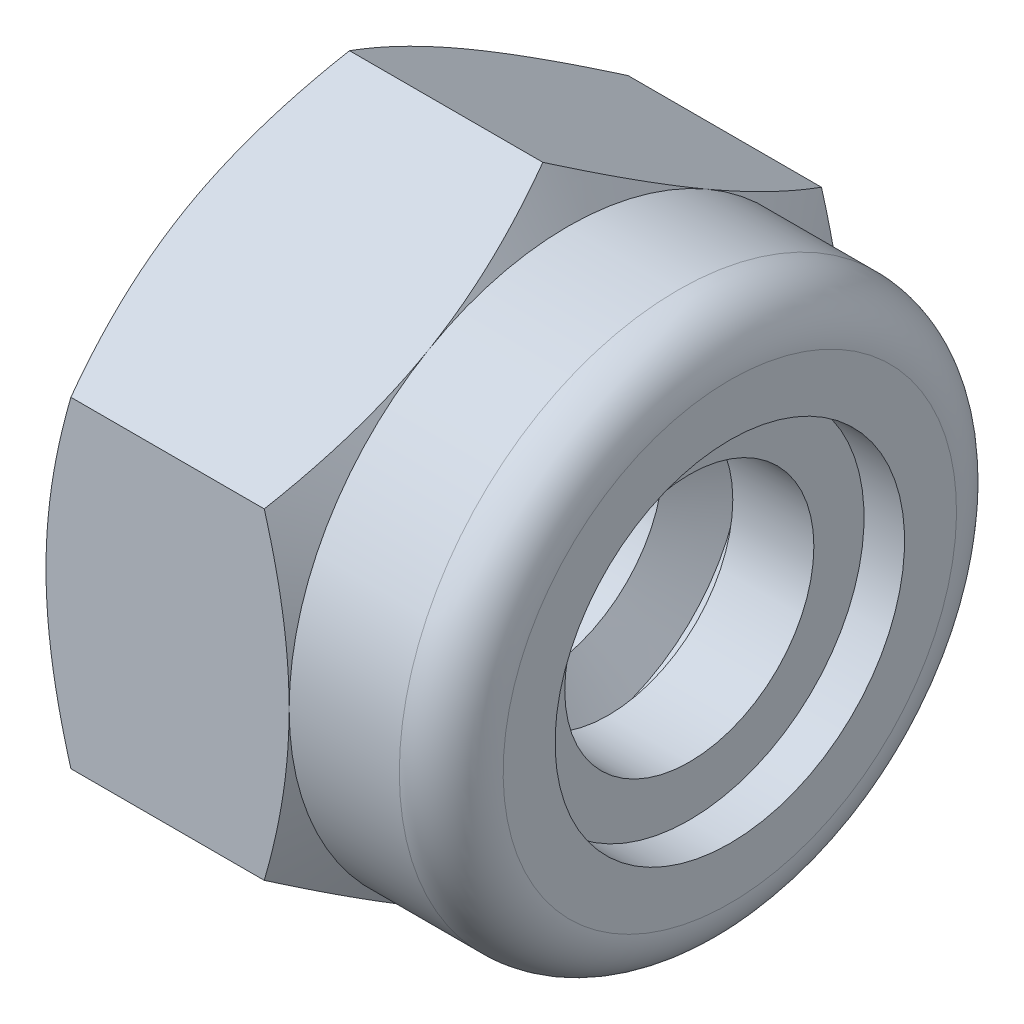
ISO-10303-21;
HEADER;
FILE_DESCRIPTION(('STEP AP214'),'2;1');
FILE_NAME('part.step','',(''),(''),'','','');
FILE_SCHEMA(('AUTOMOTIVE_DESIGN { 1 0 10303 214 1 1 1 1 }'));
ENDSEC;
DATA;
#1=APPLICATION_CONTEXT('core data for automotive mechanical design processes');
#2=APPLICATION_PROTOCOL_DEFINITION('international standard','automotive_design',2000,#1);
#3=PRODUCT_CONTEXT('',#1,'mechanical');
#4=PRODUCT('Part','Part','',(#3));
#5=PRODUCT_RELATED_PRODUCT_CATEGORY('part','',(#4));
#6=PRODUCT_DEFINITION_FORMATION('','',#4);
#7=PRODUCT_DEFINITION_CONTEXT('part definition',#1,'design');
#8=PRODUCT_DEFINITION('design','',#6,#7);
#9=PRODUCT_DEFINITION_SHAPE('','',#8);
#10=(LENGTH_UNIT() NAMED_UNIT(*) SI_UNIT(.MILLI.,.METRE.));
#11=(NAMED_UNIT(*) PLANE_ANGLE_UNIT() SI_UNIT($,.RADIAN.));
#12=(NAMED_UNIT(*) SI_UNIT($,.STERADIAN.) SOLID_ANGLE_UNIT());
#13=UNCERTAINTY_MEASURE_WITH_UNIT(LENGTH_MEASURE(1.E-05),#10,'distance_accuracy_value','');
#14=(GEOMETRIC_REPRESENTATION_CONTEXT(3) GLOBAL_UNCERTAINTY_ASSIGNED_CONTEXT((#13)) GLOBAL_UNIT_ASSIGNED_CONTEXT((#10,
#11,#12)) REPRESENTATION_CONTEXT('',''));
#15=CARTESIAN_POINT('',(0.,0.,0.));
#16=DIRECTION('',(0.,0.,1.));
#17=DIRECTION('',(1.,0.,0.));
#18=AXIS2_PLACEMENT_3D('',#15,#16,#17);
#19=CARTESIAN_POINT('',(5.,-1.58771324027147,2.75));
#20=DIRECTION('',(0.,0.866025403784439,-0.5));
#21=DIRECTION('',(0.,0.5,0.866025403784439));
#22=AXIS2_PLACEMENT_3D('',#19,#20,#21);
#23=PLANE('',#22);
#24=CARTESIAN_POINT('',(2.1543799069394,-3.17542648054303,-1.6002824065886E-13));
#25=CARTESIAN_POINT('',(2.4,-2.75000000000232,0.736860279181575));
#26=CARTESIAN_POINT('',(2.4,-2.3815698604072,1.375));
#27=B_SPLINE_CURVE_WITH_KNOTS('',2,(#24,#25,#26),.UNSPECIFIED.,.F.,.F.,(3,3),(0.,1.),.UNSPECIFIED.);
#28=CARTESIAN_POINT('',(2.15437990693814,-3.17542648054294,0.));
#29=VERTEX_POINT('',#28);
#30=CARTESIAN_POINT('',(2.4,-2.38156986040721,1.375));
#31=VERTEX_POINT('',#30);
#32=EDGE_CURVE('E667',#29,#31,#27,.T.);
#33=ORIENTED_EDGE('',*,*,#32,.T.);
#34=CARTESIAN_POINT('',(2.4,-2.3815698604072,1.375));
#35=CARTESIAN_POINT('',(2.4,-2.18505385013521,1.71537571429182));
#36=CARTESIAN_POINT('',(2.33369548248391,-1.98006511908093,2.07042661145691));
#37=CARTESIAN_POINT('',(2.27355300018248,-1.79412709266464,2.392480720269));
#38=CARTESIAN_POINT('',(2.15437990693878,-1.58771324027142,2.75000000000009));
#39=B_SPLINE_CURVE_WITH_KNOTS('',2,(#34,#35,#36,#37,#38),.UNSPECIFIED.,.F.,.F.,(3,2,3),(0.,0.5,
1.),.UNSPECIFIED.);
#40=CARTESIAN_POINT('',(2.15437990693813,-1.58771324027147,2.75));
#41=VERTEX_POINT('',#40);
#42=EDGE_CURVE('E576',#31,#41,#39,.T.);
#43=ORIENTED_EDGE('',*,*,#42,.T.);
#44=DIRECTION('',(-1.,0.,0.));
#45=VECTOR('',#44,1.);
#46=CARTESIAN_POINT('',(5.,-1.58771324027147,2.75));
#47=LINE('',#46,#45);
#48=CARTESIAN_POINT('',(0.245620093061862,-1.58771324027147,2.75));
#49=VERTEX_POINT('',#48);
#50=EDGE_CURVE('E419',#41,#49,#47,.T.);
#51=ORIENTED_EDGE('',*,*,#50,.T.);
#52=CARTESIAN_POINT('',(0.245620093060599,-1.58771324027138,2.75000000000016));
#53=CARTESIAN_POINT('',(0.,-2.0131397208121,2.01313972081842));
#54=CARTESIAN_POINT('',(0.,-2.3815698604072,1.375));
#55=B_SPLINE_CURVE_WITH_KNOTS('',2,(#52,#53,#54),.UNSPECIFIED.,.F.,.F.,(3,3),(0.,1.),.UNSPECIFIED.);
#56=CARTESIAN_POINT('',(0.,-2.38156986040721,1.375));
#57=VERTEX_POINT('',#56);
#58=EDGE_CURVE('E127',#49,#57,#55,.T.);
#59=ORIENTED_EDGE('',*,*,#58,.T.);
#60=CARTESIAN_POINT('',(0.,-2.3815698604072,1.375));
#61=CARTESIAN_POINT('',(0.,-2.57808587067984,1.03462428570707));
#62=CARTESIAN_POINT('',(0.0663045175160774,-2.78307460173348,0.679573388543088));
#63=CARTESIAN_POINT('',(0.126446999817929,-2.96901262815049,0.357519279729742));
#64=CARTESIAN_POINT('',(0.245620093061218,-3.17542648054299,0.));
#65=B_SPLINE_CURVE_WITH_KNOTS('',2,(#60,#61,#62,#63,#64),.UNSPECIFIED.,.F.,.F.,(3,2,3),(0.,0.5,
1.),.UNSPECIFIED.);
#66=CARTESIAN_POINT('',(0.245620093061861,-3.17542648054294,0.));
#67=VERTEX_POINT('',#66);
#68=EDGE_CURVE('E436',#57,#67,#65,.T.);
#69=ORIENTED_EDGE('',*,*,#68,.T.);
#70=DIRECTION('',(-1.,0.,0.));
#71=VECTOR('',#70,1.);
#72=CARTESIAN_POINT('',(5.,-3.17542648054294,0.));
#73=LINE('',#72,#71);
#74=EDGE_CURVE('E452',#29,#67,#73,.T.);
#75=ORIENTED_EDGE('',*,*,#74,.F.);
#76=EDGE_LOOP('',(#33,#43,#51,#59,#69,#75));
#77=FACE_BOUND('',#76,.T.);
#78=ADVANCED_FACE('F16',(#77),#23,.F.);
#79=CARTESIAN_POINT('',(5.,3.17542648054294,0.));
#80=DIRECTION('',(0.,-0.866025403784439,-0.5));
#81=DIRECTION('',(0.,0.5,-0.866025403784439));
#82=AXIS2_PLACEMENT_3D('',#79,#80,#81);
#83=PLANE('',#82);
#84=CARTESIAN_POINT('',(2.1543799069394,1.58771324027138,2.75000000000016));
#85=CARTESIAN_POINT('',(2.4,2.0131397208121,2.01313972081842));
#86=CARTESIAN_POINT('',(2.4,2.3815698604072,1.375));
#87=B_SPLINE_CURVE_WITH_KNOTS('',2,(#84,#85,#86),.UNSPECIFIED.,.F.,.F.,(3,3),(0.,1.),.UNSPECIFIED.);
#88=CARTESIAN_POINT('',(2.15437990693813,1.58771324027147,2.75));
#89=VERTEX_POINT('',#88);
#90=CARTESIAN_POINT('',(2.4,2.38156986040721,1.375));
#91=VERTEX_POINT('',#90);
#92=EDGE_CURVE('E589',#89,#91,#87,.T.);
#93=ORIENTED_EDGE('',*,*,#92,.T.);
#94=CARTESIAN_POINT('',(2.4,2.3815698604072,1.375));
#95=CARTESIAN_POINT('',(2.4,2.5780858706798,1.03462428570715));
#96=CARTESIAN_POINT('',(2.33369548248391,2.78307460173348,0.67957338854309));
#97=CARTESIAN_POINT('',(2.27355300018209,2.96901262815045,0.357519279729818));
#98=CARTESIAN_POINT('',(2.15437990693878,3.17542648054299,0.));
#99=B_SPLINE_CURVE_WITH_KNOTS('',2,(#94,#95,#96,#97,#98),.UNSPECIFIED.,.F.,.F.,(3,2,3),(0.,0.5,
1.),.UNSPECIFIED.);
#100=CARTESIAN_POINT('',(2.15437990693814,3.17542648054294,0.));
#101=VERTEX_POINT('',#100);
#102=EDGE_CURVE('E11',#91,#101,#99,.T.);
#103=ORIENTED_EDGE('',*,*,#102,.T.);
#104=DIRECTION('',(-1.,0.,0.));
#105=VECTOR('',#104,1.);
#106=CARTESIAN_POINT('',(5.,3.17542648054294,0.));
#107=LINE('',#106,#105);
#108=CARTESIAN_POINT('',(0.245620093061862,3.17542648054294,0.));
#109=VERTEX_POINT('',#108);
#110=EDGE_CURVE('E165',#101,#109,#107,.T.);
#111=ORIENTED_EDGE('',*,*,#110,.T.);
#112=CARTESIAN_POINT('',(0.245620093060599,3.17542648054303,-1.5692617821637E-13));
#113=CARTESIAN_POINT('',(0.,2.75000000000231,0.736860279181582));
#114=CARTESIAN_POINT('',(0.,2.3815698604072,1.375));
#115=B_SPLINE_CURVE_WITH_KNOTS('',2,(#112,#113,#114),.UNSPECIFIED.,.F.,.F.,(3,3),(0.,1.),.UNSPECIFIED.);
#116=CARTESIAN_POINT('',(0.,2.38156986040721,1.375));
#117=VERTEX_POINT('',#116);
#118=EDGE_CURVE('E158',#109,#117,#115,.T.);
#119=ORIENTED_EDGE('',*,*,#118,.T.);
#120=CARTESIAN_POINT('',(0.,2.3815698604072,1.375));
#121=CARTESIAN_POINT('',(0.,2.18505385013356,1.71537571429469));
#122=CARTESIAN_POINT('',(0.0663045175160774,1.98006511908093,2.07042661145691));
#123=CARTESIAN_POINT('',(0.126446999818618,1.79412709266273,2.39248072027231));
#124=CARTESIAN_POINT('',(0.245620093061218,1.58771324027141,2.7500000000001));
#125=B_SPLINE_CURVE_WITH_KNOTS('',2,(#120,#121,#122,#123,#124),.UNSPECIFIED.,.F.,.F.,(3,2,3),
(0.,0.5,1.),.UNSPECIFIED.);
#126=CARTESIAN_POINT('',(0.245620093061863,1.58771324027147,2.75));
#127=VERTEX_POINT('',#126);
#128=EDGE_CURVE('E149',#117,#127,#125,.T.);
#129=ORIENTED_EDGE('',*,*,#128,.T.);
#130=DIRECTION('',(-1.,0.,0.));
#131=VECTOR('',#130,1.);
#132=CARTESIAN_POINT('',(5.,1.58771324027147,2.75));
#133=LINE('',#132,#131);
#134=EDGE_CURVE('E155',#89,#127,#133,.T.);
#135=ORIENTED_EDGE('',*,*,#134,.F.);
#136=EDGE_LOOP('',(#93,#103,#111,#119,#129,#135));
#137=FACE_BOUND('',#136,.T.);
#138=ADVANCED_FACE('F153',(#137),#83,.F.);
#139=CARTESIAN_POINT('',(2.4,0.,0.));
#140=DIRECTION('',(-1.,0.,0.));
#141=DIRECTION('',(0.,-1.,0.));
#142=AXIS2_PLACEMENT_3D('',#139,#140,#141);
#143=CONICAL_SURFACE('',#142,2.75,1.0471975511966);
#144=CARTESIAN_POINT('',(2.4,2.3815698604072,-1.375));
#145=CARTESIAN_POINT('',(2.4,2.18505385013459,-1.71537571429289));
#146=CARTESIAN_POINT('',(2.33369548248391,1.98006511908093,-2.07042661145691));
#147=CARTESIAN_POINT('',(2.27355300018207,1.79412709266394,-2.39248072027022));
#148=CARTESIAN_POINT('',(2.15437990693878,1.58771324027142,-2.75000000000009));
#149=B_SPLINE_CURVE_WITH_KNOTS('',2,(#144,#145,#146,#147,#148),.UNSPECIFIED.,.F.,.F.,(3,2,3),
(0.,0.5,1.),.UNSPECIFIED.);
#150=CARTESIAN_POINT('',(2.4,2.38156986040721,-1.375));
#151=VERTEX_POINT('',#150);
#152=CARTESIAN_POINT('',(2.15437990693813,1.58771324027147,-2.75));
#153=VERTEX_POINT('',#152);
#154=EDGE_CURVE('E194',#151,#153,#149,.T.);
#155=ORIENTED_EDGE('',*,*,#154,.F.);
#156=CARTESIAN_POINT('',(2.4,0.,0.));
#157=DIRECTION('',(1.,0.,0.));
#158=DIRECTION('',(0.,1.,0.));
#159=AXIS2_PLACEMENT_3D('',#156,#157,#158);
#160=CIRCLE('',#159,2.75);
#161=CARTESIAN_POINT('',(2.40000000000156,1.24444177268012E-13,-2.75));
#162=VERTEX_POINT('',#161);
#163=EDGE_CURVE('E646',#162,#151,#160,.T.);
#164=ORIENTED_EDGE('',*,*,#163,.F.);
#165=CARTESIAN_POINT('',(2.15437990693813,1.58771324027147,-2.75));
#166=CARTESIAN_POINT('',(2.27292535233722,1.1770597713973,-2.75));
#167=CARTESIAN_POINT('',(2.3332244982029,0.80591500351772,-2.75));
#168=CARTESIAN_POINT('',(2.4,0.39490788627372,-2.75));
#169=CARTESIAN_POINT('',(2.4,2.59991680962024E-13,-2.75));
#170=B_SPLINE_CURVE_WITH_KNOTS('',2,(#165,#166,#167,#168,#169),.UNSPECIFIED.,.F.,.F.,(3,2,3),
(0.,0.5,1.),.UNSPECIFIED.);
#171=EDGE_CURVE('E660',#153,#162,#170,.T.);
#172=ORIENTED_EDGE('',*,*,#171,.F.);
#173=EDGE_LOOP('',(#155,#164,#172));
#174=FACE_BOUND('',#173,.T.);
#175=ADVANCED_FACE('F472',(#174),#143,.T.);
#176=CARTESIAN_POINT('',(2.4,0.,0.));
#177=DIRECTION('',(-1.,0.,0.));
#178=DIRECTION('',(0.,-1.,0.));
#179=AXIS2_PLACEMENT_3D('',#176,#177,#178);
#180=CONICAL_SURFACE('',#179,2.75,1.0471975511966);
#181=CARTESIAN_POINT('',(2.1543799069394,3.17542648054303,1.6002824065886E-13));
#182=CARTESIAN_POINT('',(2.4,2.75000000000232,-0.736860279181575));
#183=CARTESIAN_POINT('',(2.4,2.3815698604072,-1.375));
#184=B_SPLINE_CURVE_WITH_KNOTS('',2,(#181,#182,#183),.UNSPECIFIED.,.F.,.F.,(3,3),(0.,1.),.UNSPECIFIED.);
#185=EDGE_CURVE('E657',#101,#151,#184,.T.);
#186=ORIENTED_EDGE('',*,*,#185,.F.);
#187=ORIENTED_EDGE('',*,*,#102,.F.);
#188=CARTESIAN_POINT('',(2.4,0.,0.));
#189=DIRECTION('',(1.,0.,0.));
#190=DIRECTION('',(0.,1.,0.));
#191=AXIS2_PLACEMENT_3D('',#188,#189,#190);
#192=CIRCLE('',#191,2.75);
#193=EDGE_CURVE('E638',#151,#91,#192,.T.);
#194=ORIENTED_EDGE('',*,*,#193,.F.);
#195=EDGE_LOOP('',(#186,#187,#194));
#196=FACE_BOUND('',#195,.T.);
#197=ADVANCED_FACE('F356',(#196),#180,.T.);
#198=CARTESIAN_POINT('',(3.4875,0.,0.));
#199=DIRECTION('',(1.,0.,0.));
#200=DIRECTION('',(0.,1.,0.));
#201=AXIS2_PLACEMENT_3D('',#198,#199,#200);
#202=TOROIDAL_SURFACE('',#201,2.2375,0.5125);
#203=CARTESIAN_POINT('',(4.,0.,0.));
#204=DIRECTION('',(1.,0.,0.));
#205=DIRECTION('',(0.,1.,0.));
#206=AXIS2_PLACEMENT_3D('',#203,#204,#205);
#207=CIRCLE('',#206,2.2375);
#208=CARTESIAN_POINT('',(4.,2.2375,0.));
#209=VERTEX_POINT('',#208);
#210=EDGE_CURVE('E28',#209,#209,#207,.T.);
#211=ORIENTED_EDGE('',*,*,#210,.F.);
#212=EDGE_LOOP('',(#211));
#213=FACE_BOUND('',#212,.T.);
#214=CARTESIAN_POINT('',(3.4875,0.,0.));
#215=DIRECTION('',(1.,0.,0.));
#216=DIRECTION('',(0.,1.,0.));
#217=AXIS2_PLACEMENT_3D('',#214,#215,#216);
#218=CIRCLE('',#217,2.75);
#219=CARTESIAN_POINT('',(3.4875,2.75,0.));
#220=VERTEX_POINT('',#219);
#221=EDGE_CURVE('E645',#220,#220,#218,.T.);
#222=ORIENTED_EDGE('',*,*,#221,.T.);
#223=EDGE_LOOP('',(#222));
#224=FACE_BOUND('',#223,.T.);
#225=ADVANCED_FACE('F257',(#213,#224),#202,.T.);
#226=CARTESIAN_POINT('',(4.,1.725,0.));
#227=DIRECTION('',(1.,0.,0.));
#228=DIRECTION('',(0.,1.,0.));
#229=AXIS2_PLACEMENT_3D('',#226,#227,#228);
#230=PLANE('',#229);
#231=CARTESIAN_POINT('',(4.,0.,0.));
#232=DIRECTION('',(1.,0.,0.));
#233=DIRECTION('',(0.,1.,0.));
#234=AXIS2_PLACEMENT_3D('',#231,#232,#233);
#235=CIRCLE('',#234,1.725);
#236=CARTESIAN_POINT('',(4.,1.725,0.));
#237=VERTEX_POINT('',#236);
#238=EDGE_CURVE('E719',#237,#237,#235,.T.);
#239=ORIENTED_EDGE('',*,*,#238,.F.);
#240=EDGE_LOOP('',(#239));
#241=FACE_BOUND('',#240,.T.);
#242=ORIENTED_EDGE('',*,*,#210,.T.);
#243=EDGE_LOOP('',(#242));
#244=FACE_BOUND('',#243,.T.);
#245=ADVANCED_FACE('F554',(#241,#244),#230,.T.);
#246=CARTESIAN_POINT('',(4.,0.,0.));
#247=DIRECTION('',(1.,0.,0.));
#248=DIRECTION('',(0.,1.,0.));
#249=AXIS2_PLACEMENT_3D('',#246,#247,#248);
#250=CYLINDRICAL_SURFACE('',#249,1.725);
#251=CARTESIAN_POINT('',(3.6,0.,0.));
#252=DIRECTION('',(1.,0.,0.));
#253=DIRECTION('',(0.,1.,0.));
#254=AXIS2_PLACEMENT_3D('',#251,#252,#253);
#255=CIRCLE('',#254,1.725);
#256=CARTESIAN_POINT('',(3.6,1.725,0.));
#257=VERTEX_POINT('',#256);
#258=EDGE_CURVE('E721',#257,#257,#255,.T.);
#259=ORIENTED_EDGE('',*,*,#258,.F.);
#260=EDGE_LOOP('',(#259));
#261=FACE_BOUND('',#260,.T.);
#262=ORIENTED_EDGE('',*,*,#238,.T.);
#263=EDGE_LOOP('',(#262));
#264=FACE_BOUND('',#263,.T.);
#265=ADVANCED_FACE('F526',(#261,#264),#250,.F.);
#266=CARTESIAN_POINT('',(3.6,1.2295,0.));
#267=DIRECTION('',(1.,0.,0.));
#268=DIRECTION('',(0.,1.,0.));
#269=AXIS2_PLACEMENT_3D('',#266,#267,#268);
#270=PLANE('',#269);
#271=CARTESIAN_POINT('',(3.6,0.,0.));
#272=DIRECTION('',(1.,0.,0.));
#273=DIRECTION('',(0.,1.,0.));
#274=AXIS2_PLACEMENT_3D('',#271,#272,#273);
#275=CIRCLE('',#274,1.2295);
#276=CARTESIAN_POINT('',(3.6,1.2295,0.));
#277=VERTEX_POINT('',#276);
#278=EDGE_CURVE('E722',#277,#277,#275,.T.);
#279=ORIENTED_EDGE('',*,*,#278,.F.);
#280=EDGE_LOOP('',(#279));
#281=FACE_BOUND('',#280,.T.);
#282=ORIENTED_EDGE('',*,*,#258,.T.);
#283=EDGE_LOOP('',(#282));
#284=FACE_BOUND('',#283,.T.);
#285=ADVANCED_FACE('F735',(#281,#284),#270,.T.);
#286=CARTESIAN_POINT('',(4.,0.,0.));
#287=DIRECTION('',(1.,0.,0.));
#288=DIRECTION('',(0.,1.,0.));
#289=AXIS2_PLACEMENT_3D('',#286,#287,#288);
#290=CYLINDRICAL_SURFACE('',#289,1.2295);
#291=CARTESIAN_POINT('',(2.8,0.,0.));
#292=DIRECTION('',(1.,0.,0.));
#293=DIRECTION('',(0.,1.,0.));
#294=AXIS2_PLACEMENT_3D('',#291,#292,#293);
#295=CIRCLE('',#294,1.2295);
#296=CARTESIAN_POINT('',(2.8,1.2295,0.));
#297=VERTEX_POINT('',#296);
#298=EDGE_CURVE('E93',#297,#297,#295,.T.);
#299=ORIENTED_EDGE('',*,*,#298,.F.);
#300=EDGE_LOOP('',(#299));
#301=FACE_BOUND('',#300,.T.);
#302=ORIENTED_EDGE('',*,*,#278,.T.);
#303=EDGE_LOOP('',(#302));
#304=FACE_BOUND('',#303,.T.);
#305=ADVANCED_FACE('F601',(#301,#304),#290,.F.);
#306=CARTESIAN_POINT('',(2.8,1.725,0.));
#307=DIRECTION('',(-1.,0.,0.));
#308=DIRECTION('',(0.,-1.,0.));
#309=AXIS2_PLACEMENT_3D('',#306,#307,#308);
#310=PLANE('',#309);
#311=CARTESIAN_POINT('',(2.8,0.,0.));
#312=DIRECTION('',(1.,0.,0.));
#313=DIRECTION('',(0.,1.,0.));
#314=AXIS2_PLACEMENT_3D('',#311,#312,#313);
#315=CIRCLE('',#314,1.725);
#316=CARTESIAN_POINT('',(2.8,1.725,0.));
#317=VERTEX_POINT('',#316);
#318=EDGE_CURVE('E99',#317,#317,#315,.T.);
#319=ORIENTED_EDGE('',*,*,#318,.F.);
#320=EDGE_LOOP('',(#319));
#321=FACE_BOUND('',#320,.T.);
#322=ORIENTED_EDGE('',*,*,#298,.T.);
#323=EDGE_LOOP('',(#322));
#324=FACE_BOUND('',#323,.T.);
#325=ADVANCED_FACE('F18',(#321,#324),#310,.T.);
#326=CARTESIAN_POINT('',(4.,0.,0.));
#327=DIRECTION('',(1.,0.,0.));
#328=DIRECTION('',(0.,1.,0.));
#329=AXIS2_PLACEMENT_3D('',#326,#327,#328);
#330=CYLINDRICAL_SURFACE('',#329,1.725);
#331=CARTESIAN_POINT('',(2.4,0.,0.));
#332=DIRECTION('',(1.,0.,0.));
#333=DIRECTION('',(0.,1.,0.));
#334=AXIS2_PLACEMENT_3D('',#331,#332,#333);
#335=CIRCLE('',#334,1.725);
#336=CARTESIAN_POINT('',(2.4,1.725,0.));
#337=VERTEX_POINT('',#336);
#338=EDGE_CURVE('E725',#337,#337,#335,.T.);
#339=ORIENTED_EDGE('',*,*,#338,.F.);
#340=EDGE_LOOP('',(#339));
#341=FACE_BOUND('',#340,.T.);
#342=ORIENTED_EDGE('',*,*,#318,.T.);
#343=EDGE_LOOP('',(#342));
#344=FACE_BOUND('',#343,.T.);
#345=ADVANCED_FACE('F973',(#341,#344),#330,.F.);
#346=CARTESIAN_POINT('',(2.11392294161654,0.,0.));
#347=DIRECTION('',(1.,0.,0.));
#348=DIRECTION('',(0.,1.,0.));
#349=AXIS2_PLACEMENT_3D('',#346,#347,#348);
#350=CONICAL_SURFACE('',#349,1.2295,1.0471975511966);
#351=CARTESIAN_POINT('',(2.11392294161654,0.,0.));
#352=DIRECTION('',(1.,0.,0.));
#353=DIRECTION('',(0.,1.,0.));
#354=AXIS2_PLACEMENT_3D('',#351,#352,#353);
#355=CIRCLE('',#354,1.2295);
#356=CARTESIAN_POINT('',(2.11392294161654,1.2295,0.));
#357=VERTEX_POINT('',#356);
#358=EDGE_CURVE('E717',#357,#357,#355,.T.);
#359=ORIENTED_EDGE('',*,*,#358,.F.);
#360=EDGE_LOOP('',(#359));
#361=FACE_BOUND('',#360,.T.);
#362=ORIENTED_EDGE('',*,*,#338,.T.);
#363=EDGE_LOOP('',(#362));
#364=FACE_BOUND('',#363,.T.);
#365=ADVANCED_FACE('F964',(#361,#364),#350,.F.);
#366=CARTESIAN_POINT('',(4.,0.,0.));
#367=DIRECTION('',(1.,0.,0.));
#368=DIRECTION('',(0.,1.,0.));
#369=AXIS2_PLACEMENT_3D('',#366,#367,#368);
#370=CYLINDRICAL_SURFACE('',#369,1.2295);
#371=CARTESIAN_POINT('',(0.286077058383459,0.,0.));
#372=DIRECTION('',(1.,0.,0.));
#373=DIRECTION('',(0.,1.,0.));
#374=AXIS2_PLACEMENT_3D('',#371,#372,#373);
#375=CIRCLE('',#374,1.2295);
#376=CARTESIAN_POINT('',(0.286077058383459,1.2295,0.));
#377=VERTEX_POINT('',#376);
#378=EDGE_CURVE('E715',#377,#377,#375,.T.);
#379=ORIENTED_EDGE('',*,*,#378,.F.);
#380=EDGE_LOOP('',(#379));
#381=FACE_BOUND('',#380,.T.);
#382=ORIENTED_EDGE('',*,*,#358,.T.);
#383=EDGE_LOOP('',(#382));
#384=FACE_BOUND('',#383,.T.);
#385=ADVANCED_FACE('F214',(#381,#384),#370,.F.);
#386=CARTESIAN_POINT('',(0.,0.,0.));
#387=DIRECTION('',(-1.,0.,0.));
#388=DIRECTION('',(0.,-1.,0.));
#389=AXIS2_PLACEMENT_3D('',#386,#387,#388);
#390=CONICAL_SURFACE('',#389,1.725,1.0471975511966);
#391=CARTESIAN_POINT('',(0.,0.,0.));
#392=DIRECTION('',(1.,0.,0.));
#393=DIRECTION('',(0.,1.,0.));
#394=AXIS2_PLACEMENT_3D('',#391,#392,#393);
#395=CIRCLE('',#394,1.725);
#396=CARTESIAN_POINT('',(0.,1.725,0.));
#397=VERTEX_POINT('',#396);
#398=EDGE_CURVE('E718',#397,#397,#395,.T.);
#399=ORIENTED_EDGE('',*,*,#398,.F.);
#400=EDGE_LOOP('',(#399));
#401=FACE_BOUND('',#400,.T.);
#402=ORIENTED_EDGE('',*,*,#378,.T.);
#403=EDGE_LOOP('',(#402));
#404=FACE_BOUND('',#403,.T.);
#405=ADVANCED_FACE('F411',(#401,#404),#390,.F.);
#406=CARTESIAN_POINT('',(0.,2.75,0.));
#407=DIRECTION('',(-1.,0.,0.));
#408=DIRECTION('',(0.,-1.,0.));
#409=AXIS2_PLACEMENT_3D('',#406,#407,#408);
#410=PLANE('',#409);
#411=CARTESIAN_POINT('',(0.,0.,0.));
#412=DIRECTION('',(1.,0.,0.));
#413=DIRECTION('',(0.,1.,0.));
#414=AXIS2_PLACEMENT_3D('',#411,#412,#413);
#415=CIRCLE('',#414,2.75);
#416=CARTESIAN_POINT('',(0.,2.38156986040721,-1.375));
#417=VERTEX_POINT('',#416);
#418=EDGE_CURVE('E338',#417,#117,#415,.T.);
#419=ORIENTED_EDGE('',*,*,#418,.F.);
#420=CARTESIAN_POINT('',(0.,0.,0.));
#421=DIRECTION('',(1.,0.,0.));
#422=DIRECTION('',(0.,1.,0.));
#423=AXIS2_PLACEMENT_3D('',#420,#421,#422);
#424=CIRCLE('',#423,2.75);
#425=CARTESIAN_POINT('',(-1.55638444957982E-12,1.24591134175638E-13,-2.75));
#426=VERTEX_POINT('',#425);
#427=EDGE_CURVE('E766',#426,#417,#424,.T.);
#428=ORIENTED_EDGE('',*,*,#427,.F.);
#429=CARTESIAN_POINT('',(0.,0.,0.));
#430=DIRECTION('',(1.,0.,0.));
#431=DIRECTION('',(0.,1.,0.));
#432=AXIS2_PLACEMENT_3D('',#429,#430,#431);
#433=CIRCLE('',#432,2.75);
#434=CARTESIAN_POINT('',(0.,-2.38156986040721,-1.375));
#435=VERTEX_POINT('',#434);
#436=EDGE_CURVE('E344',#435,#426,#433,.T.);
#437=ORIENTED_EDGE('',*,*,#436,.F.);
#438=CARTESIAN_POINT('',(0.,0.,0.));
#439=DIRECTION('',(1.,0.,0.));
#440=DIRECTION('',(0.,1.,0.));
#441=AXIS2_PLACEMENT_3D('',#438,#439,#440);
#442=CIRCLE('',#441,2.75);
#443=EDGE_CURVE('E433',#57,#435,#442,.T.);
#444=ORIENTED_EDGE('',*,*,#443,.F.);
#445=CARTESIAN_POINT('',(0.,0.,0.));
#446=DIRECTION('',(1.,0.,0.));
#447=DIRECTION('',(0.,1.,0.));
#448=AXIS2_PLACEMENT_3D('',#445,#446,#447);
#449=CIRCLE('',#448,2.75);
#450=CARTESIAN_POINT('',(-1.55638444957982E-12,1.24591134175638E-13,2.75));
#451=VERTEX_POINT('',#450);
#452=EDGE_CURVE('E429',#451,#57,#449,.T.);
#453=ORIENTED_EDGE('',*,*,#452,.F.);
#454=CARTESIAN_POINT('',(0.,0.,0.));
#455=DIRECTION('',(1.,0.,0.));
#456=DIRECTION('',(0.,1.,0.));
#457=AXIS2_PLACEMENT_3D('',#454,#455,#456);
#458=CIRCLE('',#457,2.75);
#459=EDGE_CURVE('E164',#117,#451,#458,.T.);
#460=ORIENTED_EDGE('',*,*,#459,.F.);
#461=EDGE_LOOP('',(#419,#428,#437,#444,#453,#460));
#462=FACE_BOUND('',#461,.T.);
#463=ORIENTED_EDGE('',*,*,#398,.T.);
#464=EDGE_LOOP('',(#463));
#465=FACE_BOUND('',#464,.T.);
#466=ADVANCED_FACE('F381',(#462,#465),#410,.T.);
#467=CARTESIAN_POINT('',(0.793856620135735,0.,0.));
#468=DIRECTION('',(1.,0.,0.));
#469=DIRECTION('',(0.,1.,0.));
#470=AXIS2_PLACEMENT_3D('',#467,#468,#469);
#471=CONICAL_SURFACE('',#470,4.125,1.0471975511966);
#472=CARTESIAN_POINT('',(0.,2.59991680962024E-13,2.75));
#473=CARTESIAN_POINT('',(0.,-0.39161798723731,2.75));
#474=CARTESIAN_POINT('',(0.06581739075197,-0.79999415197757,2.75));
#475=CARTESIAN_POINT('',(0.12597402348135,-1.17324709739277,2.75));
#476=CARTESIAN_POINT('',(0.24562009306186,-1.58771324027148,2.75));
#477=B_SPLINE_CURVE_WITH_KNOTS('',2,(#472,#473,#474,#475,#476),.UNSPECIFIED.,.F.,.F.,(3,2,3),
(0.,0.5,1.),.UNSPECIFIED.);
#478=EDGE_CURVE('E176',#451,#49,#477,.T.);
#479=ORIENTED_EDGE('',*,*,#478,.F.);
#480=ORIENTED_EDGE('',*,*,#452,.T.);
#481=ORIENTED_EDGE('',*,*,#58,.F.);
#482=EDGE_LOOP('',(#479,#480,#481));
#483=FACE_BOUND('',#482,.T.);
#484=ADVANCED_FACE('F402',(#483),#471,.T.);
#485=CARTESIAN_POINT('',(0.793856620135735,0.,0.));
#486=DIRECTION('',(1.,0.,0.));
#487=DIRECTION('',(0.,1.,0.));
#488=AXIS2_PLACEMENT_3D('',#485,#486,#487);
#489=CONICAL_SURFACE('',#488,4.125,1.0471975511966);
#490=CARTESIAN_POINT('',(0.24562009306186,-1.58771324027147,-2.75));
#491=CARTESIAN_POINT('',(0.12614535456142,-1.17384060566394,-2.75));
#492=CARTESIAN_POINT('',(0.06581739075197,-0.799994151977566,-2.75));
#493=CARTESIAN_POINT('',(0.,-0.392130259849004,-2.75));
#494=CARTESIAN_POINT('',(0.,2.59991680962024E-13,-2.75));
#495=B_SPLINE_CURVE_WITH_KNOTS('',2,(#490,#491,#492,#493,#494),.UNSPECIFIED.,.F.,.F.,(3,2,3),
(0.,0.5,1.),.UNSPECIFIED.);
#496=CARTESIAN_POINT('',(0.245620093061862,-1.58771324027147,-2.75));
#497=VERTEX_POINT('',#496);
#498=EDGE_CURVE('E658',#497,#426,#495,.T.);
#499=ORIENTED_EDGE('',*,*,#498,.F.);
#500=CARTESIAN_POINT('',(0.,-2.3815698604072,-1.375));
#501=CARTESIAN_POINT('',(0.,-2.18505385013482,-1.7153757142925));
#502=CARTESIAN_POINT('',(0.0663045175160774,-1.98006511908093,-2.07042661145691));
#503=CARTESIAN_POINT('',(0.126446999817768,-1.7941270926642,-2.39248072026976));
#504=CARTESIAN_POINT('',(0.245620093061218,-1.58771324027141,-2.7500000000001));
#505=B_SPLINE_CURVE_WITH_KNOTS('',2,(#500,#501,#502,#503,#504),.UNSPECIFIED.,.F.,.F.,(3,2,3),
(0.,0.5,1.),.UNSPECIFIED.);
#506=EDGE_CURVE('E449',#435,#497,#505,.T.);
#507=ORIENTED_EDGE('',*,*,#506,.F.);
#508=ORIENTED_EDGE('',*,*,#436,.T.);
#509=EDGE_LOOP('',(#499,#507,#508));
#510=FACE_BOUND('',#509,.T.);
#511=ADVANCED_FACE('F292',(#510),#489,.T.);
#512=CARTESIAN_POINT('',(0.793856620135735,0.,0.));
#513=DIRECTION('',(1.,0.,0.));
#514=DIRECTION('',(0.,1.,0.));
#515=AXIS2_PLACEMENT_3D('',#512,#513,#514);
#516=CONICAL_SURFACE('',#515,4.125,1.0471975511966);
#517=ORIENTED_EDGE('',*,*,#128,.F.);
#518=ORIENTED_EDGE('',*,*,#459,.T.);
#519=CARTESIAN_POINT('',(0.24562009306186,1.58771324027147,2.75));
#520=CARTESIAN_POINT('',(0.12707464766245,1.17705977139615,2.75));
#521=CARTESIAN_POINT('',(0.0667755017971002,0.805915003517717,2.75));
#522=CARTESIAN_POINT('',(0.,0.394907886272734,2.75));
#523=CARTESIAN_POINT('',(0.,2.59991680962024E-13,2.75));
#524=B_SPLINE_CURVE_WITH_KNOTS('',2,(#519,#520,#521,#522,#523),.UNSPECIFIED.,.F.,.F.,(3,2,3),
(0.,0.5,1.),.UNSPECIFIED.);
#525=EDGE_CURVE('E169',#127,#451,#524,.T.);
#526=ORIENTED_EDGE('',*,*,#525,.F.);
#527=EDGE_LOOP('',(#517,#518,#526));
#528=FACE_BOUND('',#527,.T.);
#529=ADVANCED_FACE('F171',(#528),#516,.T.);
#530=CARTESIAN_POINT('',(5.,1.58771324027147,-2.75));
#531=DIRECTION('',(0.,-0.866025403784439,0.5));
#532=DIRECTION('',(0.,-0.5,-0.866025403784439));
#533=AXIS2_PLACEMENT_3D('',#530,#531,#532);
#534=PLANE('',#533);
#535=ORIENTED_EDGE('',*,*,#185,.T.);
#536=ORIENTED_EDGE('',*,*,#154,.T.);
#537=DIRECTION('',(-1.,0.,0.));
#538=VECTOR('',#537,1.);
#539=CARTESIAN_POINT('',(5.,1.58771324027147,-2.75));
#540=LINE('',#539,#538);
#541=CARTESIAN_POINT('',(0.245620093061862,1.58771324027147,-2.75));
#542=VERTEX_POINT('',#541);
#543=EDGE_CURVE('E136',#153,#542,#540,.T.);
#544=ORIENTED_EDGE('',*,*,#543,.T.);
#545=CARTESIAN_POINT('',(0.245620093060599,1.58771324027138,-2.75000000000016));
#546=CARTESIAN_POINT('',(0.,2.0131397208121,-2.01313972081842));
#547=CARTESIAN_POINT('',(0.,2.3815698604072,-1.375));
#548=B_SPLINE_CURVE_WITH_KNOTS('',2,(#545,#546,#547),.UNSPECIFIED.,.F.,.F.,(3,3),(0.,1.),.UNSPECIFIED.);
#549=EDGE_CURVE('E435',#542,#417,#548,.T.);
#550=ORIENTED_EDGE('',*,*,#549,.T.);
#551=CARTESIAN_POINT('',(0.,2.3815698604072,-1.375));
#552=CARTESIAN_POINT('',(0.,2.57808587068086,-1.03462428570531));
#553=CARTESIAN_POINT('',(0.0663045175160774,2.78307460173348,-0.679573388543088));
#554=CARTESIAN_POINT('',(0.126446999818618,2.96901262815168,-0.357519279727689));
#555=CARTESIAN_POINT('',(0.245620093061218,3.17542648054299,0.));
#556=B_SPLINE_CURVE_WITH_KNOTS('',2,(#551,#552,#553,#554,#555),.UNSPECIFIED.,.F.,.F.,(3,2,3),
(0.,0.5,1.),.UNSPECIFIED.);
#557=EDGE_CURVE('E240',#417,#109,#556,.T.);
#558=ORIENTED_EDGE('',*,*,#557,.T.);
#559=ORIENTED_EDGE('',*,*,#110,.F.);
#560=EDGE_LOOP('',(#535,#536,#544,#550,#558,#559));
#561=FACE_BOUND('',#560,.T.);
#562=ADVANCED_FACE('F200',(#561),#534,.F.);
#563=CARTESIAN_POINT('',(5.,-1.58771324027147,-2.75));
#564=DIRECTION('',(0.,0.,1.));
#565=DIRECTION('',(1.,0.,0.));
#566=AXIS2_PLACEMENT_3D('',#563,#564,#565);
#567=PLANE('',#566);
#568=ORIENTED_EDGE('',*,*,#171,.T.);
#569=CARTESIAN_POINT('',(2.4,2.59991680962024E-13,-2.75));
#570=CARTESIAN_POINT('',(2.4,-0.391617987236324,-2.75));
#571=CARTESIAN_POINT('',(2.33418260924803,-0.799994151977567,-2.75));
#572=CARTESIAN_POINT('',(2.27402597651898,-1.17324709739163,-2.75));
#573=CARTESIAN_POINT('',(2.15437990693815,-1.58771324027147,-2.75));
#574=B_SPLINE_CURVE_WITH_KNOTS('',2,(#569,#570,#571,#572,#573),.UNSPECIFIED.,.F.,.F.,(3,2,3),
(0.,0.5,1.),.UNSPECIFIED.);
#575=CARTESIAN_POINT('',(2.15437990693813,-1.58771324027147,-2.75));
#576=VERTEX_POINT('',#575);
#577=EDGE_CURVE('E324',#162,#576,#574,.T.);
#578=ORIENTED_EDGE('',*,*,#577,.T.);
#579=DIRECTION('',(-1.,0.,0.));
#580=VECTOR('',#579,1.);
#581=CARTESIAN_POINT('',(5.,-1.58771324027147,-2.75));
#582=LINE('',#581,#580);
#583=EDGE_CURVE('E708',#576,#497,#582,.T.);
#584=ORIENTED_EDGE('',*,*,#583,.T.);
#585=ORIENTED_EDGE('',*,*,#498,.T.);
#586=CARTESIAN_POINT('',(0.,2.59991680962024E-13,-2.75));
#587=CARTESIAN_POINT('',(0.,0.394395868524995,-2.75));
#588=CARTESIAN_POINT('',(0.0667755017971002,0.80591500351772,-2.75));
#589=CARTESIAN_POINT('',(0.12690331642912,1.17646626259404,-2.75));
#590=CARTESIAN_POINT('',(0.24562009306186,1.58771324027147,-2.75));
#591=B_SPLINE_CURVE_WITH_KNOTS('',2,(#586,#587,#588,#589,#590),.UNSPECIFIED.,.F.,.F.,(3,2,3),
(0.,0.5,1.),.UNSPECIFIED.);
#592=EDGE_CURVE('E277',#426,#542,#591,.T.);
#593=ORIENTED_EDGE('',*,*,#592,.T.);
#594=ORIENTED_EDGE('',*,*,#543,.F.);
#595=EDGE_LOOP('',(#568,#578,#584,#585,#593,#594));
#596=FACE_BOUND('',#595,.T.);
#597=ADVANCED_FACE('F210',(#596),#567,.F.);
#598=CARTESIAN_POINT('',(5.,-3.17542648054294,0.));
#599=DIRECTION('',(0.,0.866025403784439,0.5));
#600=DIRECTION('',(0.,-0.5,0.866025403784439));
#601=AXIS2_PLACEMENT_3D('',#598,#599,#600);
#602=PLANE('',#601);
#603=CARTESIAN_POINT('',(2.1543799069394,-1.58771324027138,-2.75000000000016));
#604=CARTESIAN_POINT('',(2.4,-2.0131397208121,-2.01313972081842));
#605=CARTESIAN_POINT('',(2.4,-2.3815698604072,-1.375));
#606=B_SPLINE_CURVE_WITH_KNOTS('',2,(#603,#604,#605),.UNSPECIFIED.,.F.,.F.,(3,3),(0.,1.),.UNSPECIFIED.);
#607=CARTESIAN_POINT('',(2.4,-2.38156986040721,-1.375));
#608=VERTEX_POINT('',#607);
#609=EDGE_CURVE('E335',#576,#608,#606,.T.);
#610=ORIENTED_EDGE('',*,*,#609,.T.);
#611=CARTESIAN_POINT('',(2.4,-2.3815698604072,-1.375));
#612=CARTESIAN_POINT('',(2.4,-2.57808587067977,-1.03462428570718));
#613=CARTESIAN_POINT('',(2.33369548248391,-2.78307460173348,-0.67957338854309));
#614=CARTESIAN_POINT('',(2.2735530001821,-2.96901262815042,-0.35751927972986));
#615=CARTESIAN_POINT('',(2.15437990693878,-3.17542648054299,0.));
#616=B_SPLINE_CURVE_WITH_KNOTS('',2,(#611,#612,#613,#614,#615),.UNSPECIFIED.,.F.,.F.,(3,2,3),
(0.,0.5,1.),.UNSPECIFIED.);
#617=EDGE_CURVE('E680',#608,#29,#616,.T.);
#618=ORIENTED_EDGE('',*,*,#617,.T.);
#619=ORIENTED_EDGE('',*,*,#74,.T.);
#620=CARTESIAN_POINT('',(0.245620093060599,-3.17542648054303,1.56921520207244E-13));
#621=CARTESIAN_POINT('',(0.,-2.75000000000231,-0.736860279181582));
#622=CARTESIAN_POINT('',(0.,-2.3815698604072,-1.375));
#623=B_SPLINE_CURVE_WITH_KNOTS('',2,(#620,#621,#622),.UNSPECIFIED.,.F.,.F.,(3,3),(0.,1.),.UNSPECIFIED.);
#624=EDGE_CURVE('E426',#67,#435,#623,.T.);
#625=ORIENTED_EDGE('',*,*,#624,.T.);
#626=ORIENTED_EDGE('',*,*,#506,.T.);
#627=ORIENTED_EDGE('',*,*,#583,.F.);
#628=EDGE_LOOP('',(#610,#618,#619,#625,#626,#627));
#629=FACE_BOUND('',#628,.T.);
#630=ADVANCED_FACE('F291',(#629),#602,.F.);
#631=CARTESIAN_POINT('',(4.,0.,0.));
#632=DIRECTION('',(1.,0.,0.));
#633=DIRECTION('',(0.,1.,0.));
#634=AXIS2_PLACEMENT_3D('',#631,#632,#633);
#635=CYLINDRICAL_SURFACE('',#634,2.75);
#636=ORIENTED_EDGE('',*,*,#221,.F.);
#637=EDGE_LOOP('',(#636));
#638=FACE_BOUND('',#637,.T.);
#639=ORIENTED_EDGE('',*,*,#163,.T.);
#640=ORIENTED_EDGE('',*,*,#193,.T.);
#641=CARTESIAN_POINT('',(2.4,0.,0.));
#642=DIRECTION('',(1.,0.,0.));
#643=DIRECTION('',(0.,1.,0.));
#644=AXIS2_PLACEMENT_3D('',#641,#642,#643);
#645=CIRCLE('',#644,2.75);
#646=CARTESIAN_POINT('',(2.40000000000156,1.24444177268012E-13,2.75));
#647=VERTEX_POINT('',#646);
#648=EDGE_CURVE('E649',#91,#647,#645,.T.);
#649=ORIENTED_EDGE('',*,*,#648,.T.);
#650=CARTESIAN_POINT('',(2.4,0.,0.));
#651=DIRECTION('',(1.,0.,0.));
#652=DIRECTION('',(0.,1.,0.));
#653=AXIS2_PLACEMENT_3D('',#650,#651,#652);
#654=CIRCLE('',#653,2.75);
#655=EDGE_CURVE('E651',#647,#31,#654,.T.);
#656=ORIENTED_EDGE('',*,*,#655,.T.);
#657=CARTESIAN_POINT('',(2.4,0.,0.));
#658=DIRECTION('',(1.,0.,0.));
#659=DIRECTION('',(0.,1.,0.));
#660=AXIS2_PLACEMENT_3D('',#657,#658,#659);
#661=CIRCLE('',#660,2.75);
#662=EDGE_CURVE('E677',#31,#608,#661,.T.);
#663=ORIENTED_EDGE('',*,*,#662,.T.);
#664=CARTESIAN_POINT('',(2.4,0.,0.));
#665=DIRECTION('',(1.,0.,0.));
#666=DIRECTION('',(0.,1.,0.));
#667=AXIS2_PLACEMENT_3D('',#664,#665,#666);
#668=CIRCLE('',#667,2.75);
#669=EDGE_CURVE('E333',#608,#162,#668,.T.);
#670=ORIENTED_EDGE('',*,*,#669,.T.);
#671=EDGE_LOOP('',(#639,#640,#649,#656,#663,#670));
#672=FACE_BOUND('',#671,.T.);
#673=ADVANCED_FACE('F471',(#638,#672),#635,.T.);
#674=CARTESIAN_POINT('',(2.4,0.,0.));
#675=DIRECTION('',(-1.,0.,0.));
#676=DIRECTION('',(0.,-1.,0.));
#677=AXIS2_PLACEMENT_3D('',#674,#675,#676);
#678=CONICAL_SURFACE('',#677,2.75,1.0471975511966);
#679=ORIENTED_EDGE('',*,*,#617,.F.);
#680=ORIENTED_EDGE('',*,*,#662,.F.);
#681=ORIENTED_EDGE('',*,*,#32,.F.);
#682=EDGE_LOOP('',(#679,#680,#681));
#683=FACE_BOUND('',#682,.T.);
#684=ADVANCED_FACE('F259',(#683),#678,.T.);
#685=CARTESIAN_POINT('',(2.4,0.,0.));
#686=DIRECTION('',(-1.,0.,0.));
#687=DIRECTION('',(0.,-1.,0.));
#688=AXIS2_PLACEMENT_3D('',#685,#686,#687);
#689=CONICAL_SURFACE('',#688,2.75,1.0471975511966);
#690=CARTESIAN_POINT('',(2.4,2.55004350968591E-13,2.75));
#691=CARTESIAN_POINT('',(2.4,0.394395868527182,2.75));
#692=CARTESIAN_POINT('',(2.3332244982029,0.805915003517717,2.75));
#693=CARTESIAN_POINT('',(2.27309668357015,1.17646626259656,2.75));
#694=CARTESIAN_POINT('',(2.15437990693813,1.58771324027147,2.75));
#695=B_SPLINE_CURVE_WITH_KNOTS('',2,(#690,#691,#692,#693,#694),.UNSPECIFIED.,.F.,.F.,(3,2,3),
(0.,0.5,1.),.UNSPECIFIED.);
#696=EDGE_CURVE('E182',#647,#89,#695,.T.);
#697=ORIENTED_EDGE('',*,*,#696,.F.);
#698=ORIENTED_EDGE('',*,*,#648,.F.);
#699=ORIENTED_EDGE('',*,*,#92,.F.);
#700=EDGE_LOOP('',(#697,#698,#699));
#701=FACE_BOUND('',#700,.T.);
#702=ADVANCED_FACE('F518',(#701),#689,.T.);
#703=CARTESIAN_POINT('',(2.4,0.,0.));
#704=DIRECTION('',(-1.,0.,0.));
#705=DIRECTION('',(0.,-1.,0.));
#706=AXIS2_PLACEMENT_3D('',#703,#704,#705);
#707=CONICAL_SURFACE('',#706,2.75,1.0471975511966);
#708=CARTESIAN_POINT('',(2.15437990693815,-1.58771324027148,2.75));
#709=CARTESIAN_POINT('',(2.27385464543823,-1.17384060566514,2.75));
#710=CARTESIAN_POINT('',(2.33418260924803,-0.79999415197757,2.75));
#711=CARTESIAN_POINT('',(2.4,-0.392130259850025,2.75));
#712=CARTESIAN_POINT('',(2.4,2.55004350968591E-13,2.75));
#713=B_SPLINE_CURVE_WITH_KNOTS('',2,(#708,#709,#710,#711,#712),.UNSPECIFIED.,.F.,.F.,(3,2,3),
(0.,0.5,1.),.UNSPECIFIED.);
#714=EDGE_CURVE('E185',#41,#647,#713,.T.);
#715=ORIENTED_EDGE('',*,*,#714,.F.);
#716=ORIENTED_EDGE('',*,*,#42,.F.);
#717=ORIENTED_EDGE('',*,*,#655,.F.);
#718=EDGE_LOOP('',(#715,#716,#717));
#719=FACE_BOUND('',#718,.T.);
#720=ADVANCED_FACE('F509',(#719),#707,.T.);
#721=CARTESIAN_POINT('',(2.4,0.,0.));
#722=DIRECTION('',(-1.,0.,0.));
#723=DIRECTION('',(0.,-1.,0.));
#724=AXIS2_PLACEMENT_3D('',#721,#722,#723);
#725=CONICAL_SURFACE('',#724,2.75,1.0471975511966);
#726=ORIENTED_EDGE('',*,*,#577,.F.);
#727=ORIENTED_EDGE('',*,*,#669,.F.);
#728=ORIENTED_EDGE('',*,*,#609,.F.);
#729=EDGE_LOOP('',(#726,#727,#728));
#730=FACE_BOUND('',#729,.T.);
#731=ADVANCED_FACE('F211',(#730),#725,.T.);
#732=CARTESIAN_POINT('',(0.793856620135735,0.,0.));
#733=DIRECTION('',(1.,0.,0.));
#734=DIRECTION('',(0.,1.,0.));
#735=AXIS2_PLACEMENT_3D('',#732,#733,#734);
#736=CONICAL_SURFACE('',#735,4.125,1.0471975511966);
#737=ORIENTED_EDGE('',*,*,#118,.F.);
#738=ORIENTED_EDGE('',*,*,#557,.F.);
#739=ORIENTED_EDGE('',*,*,#418,.T.);
#740=EDGE_LOOP('',(#737,#738,#739));
#741=FACE_BOUND('',#740,.T.);
#742=ADVANCED_FACE('F246',(#741),#736,.T.);
#743=CARTESIAN_POINT('',(0.793856620135735,0.,0.));
#744=DIRECTION('',(1.,0.,0.));
#745=DIRECTION('',(0.,1.,0.));
#746=AXIS2_PLACEMENT_3D('',#743,#744,#745);
#747=CONICAL_SURFACE('',#746,4.125,1.0471975511966);
#748=ORIENTED_EDGE('',*,*,#549,.F.);
#749=ORIENTED_EDGE('',*,*,#592,.F.);
#750=ORIENTED_EDGE('',*,*,#427,.T.);
#751=EDGE_LOOP('',(#748,#749,#750));
#752=FACE_BOUND('',#751,.T.);
#753=ADVANCED_FACE('F256',(#752),#747,.T.);
#754=CARTESIAN_POINT('',(0.793856620135735,0.,0.));
#755=DIRECTION('',(1.,0.,0.));
#756=DIRECTION('',(0.,1.,0.));
#757=AXIS2_PLACEMENT_3D('',#754,#755,#756);
#758=CONICAL_SURFACE('',#757,4.125,1.0471975511966);
#759=ORIENTED_EDGE('',*,*,#624,.F.);
#760=ORIENTED_EDGE('',*,*,#68,.F.);
#761=ORIENTED_EDGE('',*,*,#443,.T.);
#762=EDGE_LOOP('',(#759,#760,#761));
#763=FACE_BOUND('',#762,.T.);
#764=ADVANCED_FACE('F380',(#763),#758,.T.);
#765=CARTESIAN_POINT('',(5.,1.58771324027147,2.75));
#766=DIRECTION('',(0.,0.,-1.));
#767=DIRECTION('',(-1.,0.,0.));
#768=AXIS2_PLACEMENT_3D('',#765,#766,#767);
#769=PLANE('',#768);
#770=ORIENTED_EDGE('',*,*,#714,.T.);
#771=ORIENTED_EDGE('',*,*,#696,.T.);
#772=ORIENTED_EDGE('',*,*,#134,.T.);
#773=ORIENTED_EDGE('',*,*,#525,.T.);
#774=ORIENTED_EDGE('',*,*,#478,.T.);
#775=ORIENTED_EDGE('',*,*,#50,.F.);
#776=EDGE_LOOP('',(#770,#771,#772,#773,#774,#775));
#777=FACE_BOUND('',#776,.T.);
#778=ADVANCED_FACE('F180',(#777),#769,.F.);
#779=CLOSED_SHELL('',(#78,#138,#175,#197,#225,#245,#265,#285,#305,#325,#345,#365,#385,#405,#466,
#484,#511,#529,#562,#597,#630,#673,#684,#702,#720,#731,#742,#753,#764,#778));
#780=MANIFOLD_SOLID_BREP('B1',#779);
#781=ADVANCED_BREP_SHAPE_REPRESENTATION('',(#18,#780),#14);
#782=SHAPE_DEFINITION_REPRESENTATION(#9,#781);
ENDSEC;
END-ISO-10303-21;
